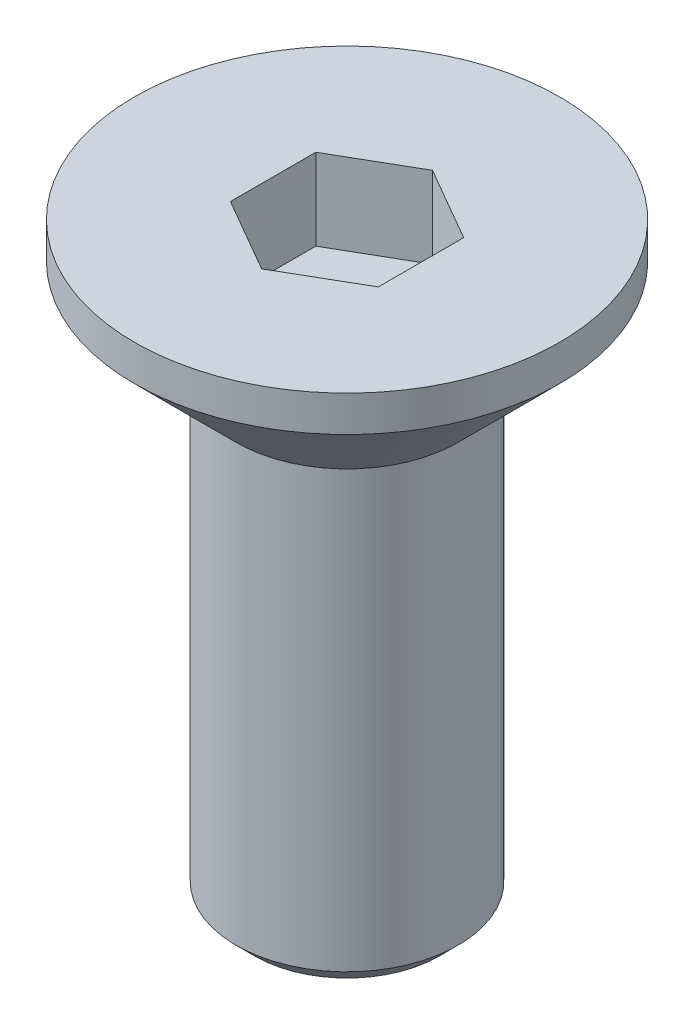
ISO-10303-21;
HEADER;
FILE_DESCRIPTION(('STEP AP214'),'2;1');
FILE_NAME('part.step','',(''),(''),'','','');
FILE_SCHEMA(('AUTOMOTIVE_DESIGN { 1 0 10303 214 1 1 1 1 }'));
ENDSEC;
DATA;
#1=APPLICATION_CONTEXT('core data for automotive mechanical design processes');
#2=APPLICATION_PROTOCOL_DEFINITION('international standard','automotive_design',2000,#1);
#3=PRODUCT_CONTEXT('',#1,'mechanical');
#4=PRODUCT('Part','Part','',(#3));
#5=PRODUCT_RELATED_PRODUCT_CATEGORY('part','',(#4));
#6=PRODUCT_DEFINITION_FORMATION('','',#4);
#7=PRODUCT_DEFINITION_CONTEXT('part definition',#1,'design');
#8=PRODUCT_DEFINITION('design','',#6,#7);
#9=PRODUCT_DEFINITION_SHAPE('','',#8);
#10=(LENGTH_UNIT() NAMED_UNIT(*) SI_UNIT(.MILLI.,.METRE.));
#11=(NAMED_UNIT(*) PLANE_ANGLE_UNIT() SI_UNIT($,.RADIAN.));
#12=(NAMED_UNIT(*) SI_UNIT($,.STERADIAN.) SOLID_ANGLE_UNIT());
#13=UNCERTAINTY_MEASURE_WITH_UNIT(LENGTH_MEASURE(1.E-05),#10,'distance_accuracy_value','');
#14=(GEOMETRIC_REPRESENTATION_CONTEXT(3) GLOBAL_UNCERTAINTY_ASSIGNED_CONTEXT((#13)) GLOBAL_UNIT_ASSIGNED_CONTEXT((#10,
#11,#12)) REPRESENTATION_CONTEXT('',''));
#15=CARTESIAN_POINT('',(0.,0.,0.));
#16=DIRECTION('',(0.,0.,1.));
#17=DIRECTION('',(1.,0.,0.));
#18=AXIS2_PLACEMENT_3D('',#15,#16,#17);
#19=CARTESIAN_POINT('',(0.,0.,0.));
#20=DIRECTION('',(0.,1.,0.));
#21=DIRECTION('',(-1.,0.,0.));
#22=AXIS2_PLACEMENT_3D('',#19,#20,#21);
#23=PLANE('',#22);
#24=DIRECTION('',(-0.866025403784438,0.,0.5));
#25=VECTOR('',#24,1.);
#26=CARTESIAN_POINT('',(0.,0.,-1.15470053837925));
#27=LINE('',#26,#25);
#28=CARTESIAN_POINT('',(0.,0.,-1.15470053837925));
#29=VERTEX_POINT('',#28);
#30=CARTESIAN_POINT('',(-1.,0.,-0.577350269189625));
#31=VERTEX_POINT('',#30);
#32=EDGE_CURVE('E49',#29,#31,#27,.T.);
#33=ORIENTED_EDGE('',*,*,#32,.F.);
#34=DIRECTION('',(-0.866025403784439,0.,-0.5));
#35=VECTOR('',#34,1.);
#36=CARTESIAN_POINT('',(1.,0.,-0.577350269189626));
#37=LINE('',#36,#35);
#38=CARTESIAN_POINT('',(1.,0.,-0.577350269189626));
#39=VERTEX_POINT('',#38);
#40=EDGE_CURVE('E132',#39,#29,#37,.T.);
#41=ORIENTED_EDGE('',*,*,#40,.F.);
#42=DIRECTION('',(0.,0.,-1.));
#43=VECTOR('',#42,1.);
#44=CARTESIAN_POINT('',(1.,0.,0.577350269189625));
#45=LINE('',#44,#43);
#46=CARTESIAN_POINT('',(1.,0.,0.577350269189625));
#47=VERTEX_POINT('',#46);
#48=EDGE_CURVE('E130',#47,#39,#45,.T.);
#49=ORIENTED_EDGE('',*,*,#48,.F.);
#50=DIRECTION('',(0.866025403784438,0.,-0.5));
#51=VECTOR('',#50,1.);
#52=CARTESIAN_POINT('',(0.,0.,1.15470053837925));
#53=LINE('',#52,#51);
#54=CARTESIAN_POINT('',(0.,0.,1.15470053837925));
#55=VERTEX_POINT('',#54);
#56=EDGE_CURVE('E97',#55,#47,#53,.T.);
#57=ORIENTED_EDGE('',*,*,#56,.F.);
#58=DIRECTION('',(0.866025403784439,0.,0.5));
#59=VECTOR('',#58,1.);
#60=CARTESIAN_POINT('',(-1.,0.,0.577350269189626));
#61=LINE('',#60,#59);
#62=CARTESIAN_POINT('',(-1.,0.,0.577350269189626));
#63=VERTEX_POINT('',#62);
#64=EDGE_CURVE('E126',#63,#55,#61,.T.);
#65=ORIENTED_EDGE('',*,*,#64,.F.);
#66=DIRECTION('',(0.,0.,1.));
#67=VECTOR('',#66,1.);
#68=CARTESIAN_POINT('',(-1.,0.,-0.577350269189625));
#69=LINE('',#68,#67);
#70=EDGE_CURVE('E123',#31,#63,#69,.T.);
#71=ORIENTED_EDGE('',*,*,#70,.F.);
#72=EDGE_LOOP('',(#33,#41,#49,#57,#65,#71));
#73=FACE_BOUND('',#72,.T.);
#74=CARTESIAN_POINT('',(0.,0.,0.));
#75=DIRECTION('',(0.,1.,0.));
#76=DIRECTION('',(-1.,0.,0.));
#77=AXIS2_PLACEMENT_3D('',#74,#75,#76);
#78=CIRCLE('',#77,2.875);
#79=CARTESIAN_POINT('',(-2.875,0.,0.));
#80=VERTEX_POINT('',#79);
#81=EDGE_CURVE('E11',#80,#80,#78,.T.);
#82=ORIENTED_EDGE('',*,*,#81,.T.);
#83=EDGE_LOOP('',(#82));
#84=FACE_BOUND('',#83,.T.);
#85=ADVANCED_FACE('F35',(#73,#84),#23,.T.);
#86=CARTESIAN_POINT('',(0.,0.,0.));
#87=DIRECTION('',(0.,1.,0.));
#88=DIRECTION('',(-1.,0.,0.));
#89=AXIS2_PLACEMENT_3D('',#86,#87,#88);
#90=CYLINDRICAL_SURFACE('',#89,2.875);
#91=CARTESIAN_POINT('',(0.,-0.485000000000006,0.));
#92=DIRECTION('',(0.,1.,0.));
#93=DIRECTION('',(-1.,0.,0.));
#94=AXIS2_PLACEMENT_3D('',#91,#92,#93);
#95=CIRCLE('',#94,2.875);
#96=CARTESIAN_POINT('',(-2.875,-0.485000000000006,0.));
#97=VERTEX_POINT('',#96);
#98=EDGE_CURVE('E42',#97,#97,#95,.T.);
#99=ORIENTED_EDGE('',*,*,#98,.T.);
#100=EDGE_LOOP('',(#99));
#101=FACE_BOUND('',#100,.T.);
#102=ORIENTED_EDGE('',*,*,#81,.F.);
#103=EDGE_LOOP('',(#102));
#104=FACE_BOUND('',#103,.T.);
#105=ADVANCED_FACE('F152',(#101,#104),#90,.T.);
#106=CARTESIAN_POINT('',(0.,-0.485000000000006,0.));
#107=DIRECTION('',(0.,1.,0.));
#108=DIRECTION('',(-1.,0.,0.));
#109=AXIS2_PLACEMENT_3D('',#106,#107,#108);
#110=CONICAL_SURFACE('',#109,2.875,0.78539816339745);
#111=CARTESIAN_POINT('',(0.,-1.86,0.));
#112=DIRECTION('',(0.,1.,0.));
#113=DIRECTION('',(-1.,0.,0.));
#114=AXIS2_PLACEMENT_3D('',#111,#112,#113);
#115=CIRCLE('',#114,1.5);
#116=CARTESIAN_POINT('',(-1.5,-1.86,0.));
#117=VERTEX_POINT('',#116);
#118=EDGE_CURVE('E147',#117,#117,#115,.T.);
#119=ORIENTED_EDGE('',*,*,#118,.T.);
#120=EDGE_LOOP('',(#119));
#121=FACE_BOUND('',#120,.T.);
#122=ORIENTED_EDGE('',*,*,#98,.F.);
#123=EDGE_LOOP('',(#122));
#124=FACE_BOUND('',#123,.T.);
#125=ADVANCED_FACE('F155',(#121,#124),#110,.T.);
#126=CARTESIAN_POINT('',(0.,0.,0.));
#127=DIRECTION('',(0.,1.,0.));
#128=DIRECTION('',(-1.,0.,0.));
#129=AXIS2_PLACEMENT_3D('',#126,#127,#128);
#130=CYLINDRICAL_SURFACE('',#129,1.5);
#131=CARTESIAN_POINT('',(0.,-7.75,0.));
#132=DIRECTION('',(0.,1.,0.));
#133=DIRECTION('',(-1.,0.,0.));
#134=AXIS2_PLACEMENT_3D('',#131,#132,#133);
#135=CIRCLE('',#134,1.5);
#136=CARTESIAN_POINT('',(-1.5,-7.75,0.));
#137=VERTEX_POINT('',#136);
#138=EDGE_CURVE('E144',#137,#137,#135,.T.);
#139=ORIENTED_EDGE('',*,*,#138,.T.);
#140=EDGE_LOOP('',(#139));
#141=FACE_BOUND('',#140,.T.);
#142=ORIENTED_EDGE('',*,*,#118,.F.);
#143=EDGE_LOOP('',(#142));
#144=FACE_BOUND('',#143,.T.);
#145=ADVANCED_FACE('F157',(#141,#144),#130,.T.);
#146=CARTESIAN_POINT('',(0.,-7.75,0.));
#147=DIRECTION('',(0.,1.,0.));
#148=DIRECTION('',(-1.,0.,0.));
#149=AXIS2_PLACEMENT_3D('',#146,#147,#148);
#150=CONICAL_SURFACE('',#149,1.5,0.785398163397448);
#151=CARTESIAN_POINT('',(0.,-8.,0.));
#152=DIRECTION('',(0.,1.,0.));
#153=DIRECTION('',(-1.,0.,0.));
#154=AXIS2_PLACEMENT_3D('',#151,#152,#153);
#155=CIRCLE('',#154,1.25);
#156=CARTESIAN_POINT('',(-1.25,-8.,0.));
#157=VERTEX_POINT('',#156);
#158=EDGE_CURVE('E136',#157,#157,#155,.T.);
#159=ORIENTED_EDGE('',*,*,#158,.T.);
#160=EDGE_LOOP('',(#159));
#161=FACE_BOUND('',#160,.T.);
#162=ORIENTED_EDGE('',*,*,#138,.F.);
#163=EDGE_LOOP('',(#162));
#164=FACE_BOUND('',#163,.T.);
#165=ADVANCED_FACE('F164',(#161,#164),#150,.T.);
#166=CARTESIAN_POINT('',(-1.25,-8.,0.));
#167=DIRECTION('',(0.,-1.,0.));
#168=DIRECTION('',(1.,0.,0.));
#169=AXIS2_PLACEMENT_3D('',#166,#167,#168);
#170=PLANE('',#169);
#171=ORIENTED_EDGE('',*,*,#158,.F.);
#172=EDGE_LOOP('',(#171));
#173=FACE_BOUND('',#172,.T.);
#174=ADVANCED_FACE('F182',(#173),#170,.T.);
#175=CARTESIAN_POINT('',(0.,-1.1,-1.15470053837925));
#176=DIRECTION('',(-0.5,0.,-0.866025403784438));
#177=DIRECTION('',(-0.866025403784438,0.,0.5));
#178=AXIS2_PLACEMENT_3D('',#175,#176,#177);
#179=PLANE('',#178);
#180=ORIENTED_EDGE('',*,*,#32,.T.);
#181=DIRECTION('',(0.,1.,0.));
#182=VECTOR('',#181,1.);
#183=CARTESIAN_POINT('',(-1.,-1.1,-0.577350269189625));
#184=LINE('',#183,#182);
#185=CARTESIAN_POINT('',(-1.,-1.1,-0.577350269189625));
#186=VERTEX_POINT('',#185);
#187=EDGE_CURVE('E79',#186,#31,#184,.T.);
#188=ORIENTED_EDGE('',*,*,#187,.F.);
#189=DIRECTION('',(-0.866025403784438,0.,0.5));
#190=VECTOR('',#189,1.);
#191=CARTESIAN_POINT('',(0.,-1.1,-1.15470053837925));
#192=LINE('',#191,#190);
#193=CARTESIAN_POINT('',(0.,-1.1,-1.15470053837925));
#194=VERTEX_POINT('',#193);
#195=EDGE_CURVE('E134',#194,#186,#192,.T.);
#196=ORIENTED_EDGE('',*,*,#195,.F.);
#197=DIRECTION('',(0.,1.,0.));
#198=VECTOR('',#197,1.);
#199=CARTESIAN_POINT('',(0.,-1.1,-1.15470053837925));
#200=LINE('',#199,#198);
#201=EDGE_CURVE('E57',#194,#29,#200,.T.);
#202=ORIENTED_EDGE('',*,*,#201,.T.);
#203=EDGE_LOOP('',(#180,#188,#196,#202));
#204=FACE_BOUND('',#203,.T.);
#205=ADVANCED_FACE('F179',(#204),#179,.F.);
#206=CARTESIAN_POINT('',(1.,-1.1,-0.577350269189626));
#207=DIRECTION('',(0.5,0.,-0.866025403784439));
#208=DIRECTION('',(-0.866025403784439,0.,-0.5));
#209=AXIS2_PLACEMENT_3D('',#206,#207,#208);
#210=PLANE('',#209);
#211=ORIENTED_EDGE('',*,*,#40,.T.);
#212=ORIENTED_EDGE('',*,*,#201,.F.);
#213=DIRECTION('',(-0.866025403784439,0.,-0.5));
#214=VECTOR('',#213,1.);
#215=CARTESIAN_POINT('',(1.,-1.1,-0.577350269189626));
#216=LINE('',#215,#214);
#217=CARTESIAN_POINT('',(1.,-1.1,-0.577350269189626));
#218=VERTEX_POINT('',#217);
#219=EDGE_CURVE('E109',#218,#194,#216,.T.);
#220=ORIENTED_EDGE('',*,*,#219,.F.);
#221=DIRECTION('',(0.,1.,0.));
#222=VECTOR('',#221,1.);
#223=CARTESIAN_POINT('',(1.,-1.1,-0.577350269189626));
#224=LINE('',#223,#222);
#225=EDGE_CURVE('E101',#218,#39,#224,.T.);
#226=ORIENTED_EDGE('',*,*,#225,.T.);
#227=EDGE_LOOP('',(#211,#212,#220,#226));
#228=FACE_BOUND('',#227,.T.);
#229=ADVANCED_FACE('F181',(#228),#210,.F.);
#230=CARTESIAN_POINT('',(1.,-1.1,0.577350269189625));
#231=DIRECTION('',(1.,0.,0.));
#232=DIRECTION('',(0.,0.,-1.));
#233=AXIS2_PLACEMENT_3D('',#230,#231,#232);
#234=PLANE('',#233);
#235=ORIENTED_EDGE('',*,*,#48,.T.);
#236=ORIENTED_EDGE('',*,*,#225,.F.);
#237=DIRECTION('',(0.,0.,-1.));
#238=VECTOR('',#237,1.);
#239=CARTESIAN_POINT('',(1.,-1.1,0.577350269189625));
#240=LINE('',#239,#238);
#241=CARTESIAN_POINT('',(1.,-1.1,0.577350269189625));
#242=VERTEX_POINT('',#241);
#243=EDGE_CURVE('E105',#242,#218,#240,.T.);
#244=ORIENTED_EDGE('',*,*,#243,.F.);
#245=DIRECTION('',(0.,1.,0.));
#246=VECTOR('',#245,1.);
#247=CARTESIAN_POINT('',(1.,-1.1,0.577350269189625));
#248=LINE('',#247,#246);
#249=EDGE_CURVE('E90',#242,#47,#248,.T.);
#250=ORIENTED_EDGE('',*,*,#249,.T.);
#251=EDGE_LOOP('',(#235,#236,#244,#250));
#252=FACE_BOUND('',#251,.T.);
#253=ADVANCED_FACE('F106',(#252),#234,.F.);
#254=CARTESIAN_POINT('',(0.,-1.1,1.15470053837925));
#255=DIRECTION('',(0.5,0.,0.866025403784438));
#256=DIRECTION('',(0.866025403784438,0.,-0.5));
#257=AXIS2_PLACEMENT_3D('',#254,#255,#256);
#258=PLANE('',#257);
#259=ORIENTED_EDGE('',*,*,#56,.T.);
#260=ORIENTED_EDGE('',*,*,#249,.F.);
#261=DIRECTION('',(0.866025403784438,0.,-0.5));
#262=VECTOR('',#261,1.);
#263=CARTESIAN_POINT('',(0.,-1.1,1.15470053837925));
#264=LINE('',#263,#262);
#265=CARTESIAN_POINT('',(0.,-1.1,1.15470053837925));
#266=VERTEX_POINT('',#265);
#267=EDGE_CURVE('E94',#266,#242,#264,.T.);
#268=ORIENTED_EDGE('',*,*,#267,.F.);
#269=DIRECTION('',(0.,1.,0.));
#270=VECTOR('',#269,1.);
#271=CARTESIAN_POINT('',(0.,-1.1,1.15470053837925));
#272=LINE('',#271,#270);
#273=EDGE_CURVE('E102',#266,#55,#272,.T.);
#274=ORIENTED_EDGE('',*,*,#273,.T.);
#275=EDGE_LOOP('',(#259,#260,#268,#274));
#276=FACE_BOUND('',#275,.T.);
#277=ADVANCED_FACE('F92',(#276),#258,.F.);
#278=CARTESIAN_POINT('',(-1.,-1.1,0.577350269189626));
#279=DIRECTION('',(-0.5,0.,0.866025403784438));
#280=DIRECTION('',(0.866025403784439,0.,0.5));
#281=AXIS2_PLACEMENT_3D('',#278,#279,#280);
#282=PLANE('',#281);
#283=ORIENTED_EDGE('',*,*,#64,.T.);
#284=ORIENTED_EDGE('',*,*,#273,.F.);
#285=DIRECTION('',(0.866025403784439,0.,0.5));
#286=VECTOR('',#285,1.);
#287=CARTESIAN_POINT('',(-1.,-1.1,0.577350269189626));
#288=LINE('',#287,#286);
#289=CARTESIAN_POINT('',(-1.,-1.1,0.577350269189626));
#290=VERTEX_POINT('',#289);
#291=EDGE_CURVE('E115',#290,#266,#288,.T.);
#292=ORIENTED_EDGE('',*,*,#291,.F.);
#293=DIRECTION('',(0.,1.,0.));
#294=VECTOR('',#293,1.);
#295=CARTESIAN_POINT('',(-1.,-1.1,0.577350269189626));
#296=LINE('',#295,#294);
#297=EDGE_CURVE('E139',#290,#63,#296,.T.);
#298=ORIENTED_EDGE('',*,*,#297,.T.);
#299=EDGE_LOOP('',(#283,#284,#292,#298));
#300=FACE_BOUND('',#299,.T.);
#301=ADVANCED_FACE('F241',(#300),#282,.F.);
#302=CARTESIAN_POINT('',(-1.,-1.1,-0.577350269189625));
#303=DIRECTION('',(-1.,0.,0.));
#304=DIRECTION('',(0.,-1.,0.));
#305=AXIS2_PLACEMENT_3D('',#302,#303,#304);
#306=PLANE('',#305);
#307=ORIENTED_EDGE('',*,*,#70,.T.);
#308=ORIENTED_EDGE('',*,*,#297,.F.);
#309=DIRECTION('',(0.,0.,1.));
#310=VECTOR('',#309,1.);
#311=CARTESIAN_POINT('',(-1.,-1.1,-0.577350269189625));
#312=LINE('',#311,#310);
#313=EDGE_CURVE('E117',#186,#290,#312,.T.);
#314=ORIENTED_EDGE('',*,*,#313,.F.);
#315=ORIENTED_EDGE('',*,*,#187,.T.);
#316=EDGE_LOOP('',(#307,#308,#314,#315));
#317=FACE_BOUND('',#316,.T.);
#318=ADVANCED_FACE('F177',(#317),#306,.F.);
#319=CARTESIAN_POINT('',(0.,-1.1,0.));
#320=DIRECTION('',(0.,1.,0.));
#321=DIRECTION('',(-1.,0.,0.));
#322=AXIS2_PLACEMENT_3D('',#319,#320,#321);
#323=PLANE('',#322);
#324=ORIENTED_EDGE('',*,*,#195,.T.);
#325=ORIENTED_EDGE('',*,*,#313,.T.);
#326=ORIENTED_EDGE('',*,*,#291,.T.);
#327=ORIENTED_EDGE('',*,*,#267,.T.);
#328=ORIENTED_EDGE('',*,*,#243,.T.);
#329=ORIENTED_EDGE('',*,*,#219,.T.);
#330=EDGE_LOOP('',(#324,#325,#326,#327,#328,#329));
#331=FACE_BOUND('',#330,.T.);
#332=ADVANCED_FACE('F112',(#331),#323,.T.);
#333=CLOSED_SHELL('',(#85,#105,#125,#145,#165,#174,#205,#229,#253,#277,#301,#318,#332));
#334=MANIFOLD_SOLID_BREP('B2',#333);
#335=ADVANCED_BREP_SHAPE_REPRESENTATION('',(#18,#334),#14);
#336=SHAPE_DEFINITION_REPRESENTATION(#9,#335);
ENDSEC;
END-ISO-10303-21;
